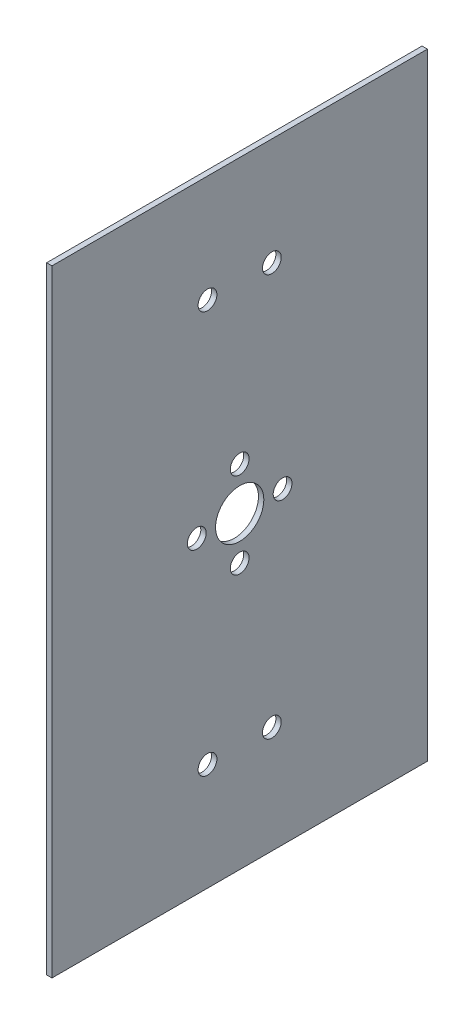
ISO-10303-21;
HEADER;
FILE_DESCRIPTION(('STEP AP214'),'2;1');
FILE_NAME('part.step','',(''),(''),'','','');
FILE_SCHEMA(('AUTOMOTIVE_DESIGN { 1 0 10303 214 1 1 1 1 }'));
ENDSEC;
DATA;
#1=APPLICATION_CONTEXT('core data for automotive mechanical design processes');
#2=APPLICATION_PROTOCOL_DEFINITION('international standard','automotive_design',2000,#1);
#3=PRODUCT_CONTEXT('',#1,'mechanical');
#4=PRODUCT('Part','Part','',(#3));
#5=PRODUCT_RELATED_PRODUCT_CATEGORY('part','',(#4));
#6=PRODUCT_DEFINITION_FORMATION('','',#4);
#7=PRODUCT_DEFINITION_CONTEXT('part definition',#1,'design');
#8=PRODUCT_DEFINITION('design','',#6,#7);
#9=PRODUCT_DEFINITION_SHAPE('','',#8);
#10=(LENGTH_UNIT() NAMED_UNIT(*) SI_UNIT(.MILLI.,.METRE.));
#11=(NAMED_UNIT(*) PLANE_ANGLE_UNIT() SI_UNIT($,.RADIAN.));
#12=(NAMED_UNIT(*) SI_UNIT($,.STERADIAN.) SOLID_ANGLE_UNIT());
#13=UNCERTAINTY_MEASURE_WITH_UNIT(LENGTH_MEASURE(1.E-05),#10,'distance_accuracy_value','');
#14=(GEOMETRIC_REPRESENTATION_CONTEXT(3) GLOBAL_UNCERTAINTY_ASSIGNED_CONTEXT((#13)) GLOBAL_UNIT_ASSIGNED_CONTEXT((#10,
#11,#12)) REPRESENTATION_CONTEXT('',''));
#15=CARTESIAN_POINT('',(0.,0.,0.));
#16=DIRECTION('',(0.,0.,1.));
#17=DIRECTION('',(1.,0.,0.));
#18=AXIS2_PLACEMENT_3D('',#15,#16,#17);
#19=CARTESIAN_POINT('',(1.,0.,0.));
#20=DIRECTION('',(1.,0.,0.));
#21=DIRECTION('',(0.,0.,-1.));
#22=AXIS2_PLACEMENT_3D('',#19,#20,#21);
#23=PLANE('',#22);
#24=CARTESIAN_POINT('',(1.,-37.5,-6.));
#25=DIRECTION('',(1.,0.,0.));
#26=DIRECTION('',(0.,0.,-1.));
#27=AXIS2_PLACEMENT_3D('',#24,#25,#26);
#28=CIRCLE('',#27,1.75);
#29=CARTESIAN_POINT('',(1.,-37.5,-7.75));
#30=VERTEX_POINT('',#29);
#31=EDGE_CURVE('E182',#30,#30,#28,.T.);
#32=ORIENTED_EDGE('',*,*,#31,.F.);
#33=EDGE_LOOP('',(#32));
#34=FACE_BOUND('',#33,.T.);
#35=CARTESIAN_POINT('',(1.,37.5,6.));
#36=DIRECTION('',(1.,0.,0.));
#37=DIRECTION('',(0.,0.,-1.));
#38=AXIS2_PLACEMENT_3D('',#35,#36,#37);
#39=CIRCLE('',#38,1.75);
#40=CARTESIAN_POINT('',(1.,37.5,4.25));
#41=VERTEX_POINT('',#40);
#42=EDGE_CURVE('E166',#41,#41,#39,.T.);
#43=ORIENTED_EDGE('',*,*,#42,.F.);
#44=EDGE_LOOP('',(#43));
#45=FACE_BOUND('',#44,.T.);
#46=CARTESIAN_POINT('',(1.,-8.,-5.39914649654326E-13));
#47=DIRECTION('',(1.,0.,0.));
#48=DIRECTION('',(0.,0.,-1.));
#49=AXIS2_PLACEMENT_3D('',#46,#47,#48);
#50=CIRCLE('',#49,1.75);
#51=CARTESIAN_POINT('',(1.,-8.,-1.75000000000054));
#52=VERTEX_POINT('',#51);
#53=EDGE_CURVE('E150',#52,#52,#50,.T.);
#54=ORIENTED_EDGE('',*,*,#53,.F.);
#55=EDGE_LOOP('',(#54));
#56=FACE_BOUND('',#55,.T.);
#57=CARTESIAN_POINT('',(1.,8.,0.));
#58=DIRECTION('',(1.,0.,0.));
#59=DIRECTION('',(0.,0.,-1.));
#60=AXIS2_PLACEMENT_3D('',#57,#58,#59);
#61=CIRCLE('',#60,1.75);
#62=CARTESIAN_POINT('',(1.,8.,-1.75));
#63=VERTEX_POINT('',#62);
#64=EDGE_CURVE('E134',#63,#63,#61,.T.);
#65=ORIENTED_EDGE('',*,*,#64,.F.);
#66=EDGE_LOOP('',(#65));
#67=FACE_BOUND('',#66,.T.);
#68=DIRECTION('',(0.,1.,0.));
#69=VECTOR('',#68,1.);
#70=CARTESIAN_POINT('',(1.,57.5,-35.));
#71=LINE('',#70,#69);
#72=CARTESIAN_POINT('',(1.,-57.5,-35.));
#73=VERTEX_POINT('',#72);
#74=CARTESIAN_POINT('',(1.,57.5,-35.));
#75=VERTEX_POINT('',#74);
#76=EDGE_CURVE('E92',#73,#75,#71,.T.);
#77=ORIENTED_EDGE('',*,*,#76,.T.);
#78=DIRECTION('',(0.,0.,1.));
#79=VECTOR('',#78,1.);
#80=CARTESIAN_POINT('',(1.,57.5,35.));
#81=LINE('',#80,#79);
#82=CARTESIAN_POINT('',(1.,57.5,35.));
#83=VERTEX_POINT('',#82);
#84=EDGE_CURVE('E87',#75,#83,#81,.T.);
#85=ORIENTED_EDGE('',*,*,#84,.T.);
#86=DIRECTION('',(0.,-1.,0.));
#87=VECTOR('',#86,1.);
#88=CARTESIAN_POINT('',(1.,57.5,35.));
#89=LINE('',#88,#87);
#90=CARTESIAN_POINT('',(1.,-57.5,35.));
#91=VERTEX_POINT('',#90);
#92=EDGE_CURVE('E90',#83,#91,#89,.T.);
#93=ORIENTED_EDGE('',*,*,#92,.T.);
#94=DIRECTION('',(0.,0.,-1.));
#95=VECTOR('',#94,1.);
#96=CARTESIAN_POINT('',(1.,-57.5,35.));
#97=LINE('',#96,#95);
#98=EDGE_CURVE('E57',#91,#73,#97,.T.);
#99=ORIENTED_EDGE('',*,*,#98,.T.);
#100=EDGE_LOOP('',(#77,#85,#93,#99));
#101=FACE_BOUND('',#100,.T.);
#102=CARTESIAN_POINT('',(1.,0.,0.));
#103=DIRECTION('',(1.,0.,0.));
#104=DIRECTION('',(0.,0.,-1.));
#105=AXIS2_PLACEMENT_3D('',#102,#103,#104);
#106=CIRCLE('',#105,4.5);
#107=CARTESIAN_POINT('',(1.,0.,-4.5));
#108=VERTEX_POINT('',#107);
#109=EDGE_CURVE('E112',#108,#108,#106,.T.);
#110=ORIENTED_EDGE('',*,*,#109,.F.);
#111=EDGE_LOOP('',(#110));
#112=FACE_BOUND('',#111,.T.);
#113=CARTESIAN_POINT('',(1.,2.69043291955691E-13,-8.00000000000027));
#114=DIRECTION('',(1.,0.,0.));
#115=DIRECTION('',(0.,0.,-1.));
#116=AXIS2_PLACEMENT_3D('',#113,#114,#115);
#117=CIRCLE('',#116,1.75);
#118=CARTESIAN_POINT('',(1.,2.69043291955691E-13,-9.75000000000027));
#119=VERTEX_POINT('',#118);
#120=EDGE_CURVE('E142',#119,#119,#117,.T.);
#121=ORIENTED_EDGE('',*,*,#120,.F.);
#122=EDGE_LOOP('',(#121));
#123=FACE_BOUND('',#122,.T.);
#124=CARTESIAN_POINT('',(1.,-2.70023009395009E-13,7.99999999999973));
#125=DIRECTION('',(1.,0.,0.));
#126=DIRECTION('',(0.,0.,-1.));
#127=AXIS2_PLACEMENT_3D('',#124,#125,#126);
#128=CIRCLE('',#127,1.75);
#129=CARTESIAN_POINT('',(1.,-2.70023009395009E-13,6.24999999999973));
#130=VERTEX_POINT('',#129);
#131=EDGE_CURVE('E158',#130,#130,#128,.T.);
#132=ORIENTED_EDGE('',*,*,#131,.F.);
#133=EDGE_LOOP('',(#132));
#134=FACE_BOUND('',#133,.T.);
#135=CARTESIAN_POINT('',(1.,37.5,-6.));
#136=DIRECTION('',(1.,0.,0.));
#137=DIRECTION('',(0.,0.,1.));
#138=AXIS2_PLACEMENT_3D('',#135,#136,#137);
#139=CIRCLE('',#138,1.75);
#140=CARTESIAN_POINT('',(1.,37.5,-4.25));
#141=VERTEX_POINT('',#140);
#142=EDGE_CURVE('E174',#141,#141,#139,.T.);
#143=ORIENTED_EDGE('',*,*,#142,.F.);
#144=EDGE_LOOP('',(#143));
#145=FACE_BOUND('',#144,.T.);
#146=CARTESIAN_POINT('',(1.,-37.5,6.));
#147=DIRECTION('',(1.,0.,0.));
#148=DIRECTION('',(0.,0.,1.));
#149=AXIS2_PLACEMENT_3D('',#146,#147,#148);
#150=CIRCLE('',#149,1.75);
#151=CARTESIAN_POINT('',(1.,-37.5,7.75));
#152=VERTEX_POINT('',#151);
#153=EDGE_CURVE('E190',#152,#152,#150,.T.);
#154=ORIENTED_EDGE('',*,*,#153,.F.);
#155=EDGE_LOOP('',(#154));
#156=FACE_BOUND('',#155,.T.);
#157=ADVANCED_FACE('F39',(#34,#45,#56,#67,#101,#112,#123,#134,#145,#156),#23,.T.);
#158=CARTESIAN_POINT('',(0.,0.,0.));
#159=DIRECTION('',(1.,0.,0.));
#160=DIRECTION('',(0.,0.,-1.));
#161=AXIS2_PLACEMENT_3D('',#158,#159,#160);
#162=PLANE('',#161);
#163=DIRECTION('',(0.,1.,0.));
#164=VECTOR('',#163,1.);
#165=CARTESIAN_POINT('',(0.,57.5,-35.));
#166=LINE('',#165,#164);
#167=CARTESIAN_POINT('',(0.,-57.5,-35.));
#168=VERTEX_POINT('',#167);
#169=CARTESIAN_POINT('',(0.,57.5,-35.));
#170=VERTEX_POINT('',#169);
#171=EDGE_CURVE('E108',#168,#170,#166,.T.);
#172=ORIENTED_EDGE('',*,*,#171,.F.);
#173=DIRECTION('',(0.,0.,-1.));
#174=VECTOR('',#173,1.);
#175=CARTESIAN_POINT('',(0.,-57.5,35.));
#176=LINE('',#175,#174);
#177=CARTESIAN_POINT('',(0.,-57.5,35.));
#178=VERTEX_POINT('',#177);
#179=EDGE_CURVE('E80',#178,#168,#176,.T.);
#180=ORIENTED_EDGE('',*,*,#179,.F.);
#181=DIRECTION('',(0.,-1.,0.));
#182=VECTOR('',#181,1.);
#183=CARTESIAN_POINT('',(0.,57.5,35.));
#184=LINE('',#183,#182);
#185=CARTESIAN_POINT('',(0.,57.5,35.));
#186=VERTEX_POINT('',#185);
#187=EDGE_CURVE('E74',#186,#178,#184,.T.);
#188=ORIENTED_EDGE('',*,*,#187,.F.);
#189=DIRECTION('',(0.,0.,1.));
#190=VECTOR('',#189,1.);
#191=CARTESIAN_POINT('',(0.,57.5,35.));
#192=LINE('',#191,#190);
#193=EDGE_CURVE('E97',#170,#186,#192,.T.);
#194=ORIENTED_EDGE('',*,*,#193,.F.);
#195=EDGE_LOOP('',(#172,#180,#188,#194));
#196=FACE_BOUND('',#195,.T.);
#197=CARTESIAN_POINT('',(0.,0.,0.));
#198=DIRECTION('',(1.,0.,0.));
#199=DIRECTION('',(0.,0.,-1.));
#200=AXIS2_PLACEMENT_3D('',#197,#198,#199);
#201=CIRCLE('',#200,4.5);
#202=CARTESIAN_POINT('',(0.,0.,-4.5));
#203=VERTEX_POINT('',#202);
#204=EDGE_CURVE('E130',#203,#203,#201,.T.);
#205=ORIENTED_EDGE('',*,*,#204,.T.);
#206=EDGE_LOOP('',(#205));
#207=FACE_BOUND('',#206,.T.);
#208=CARTESIAN_POINT('',(0.,8.,0.));
#209=DIRECTION('',(1.,0.,0.));
#210=DIRECTION('',(0.,0.,-1.));
#211=AXIS2_PLACEMENT_3D('',#208,#209,#210);
#212=CIRCLE('',#211,1.75);
#213=CARTESIAN_POINT('',(0.,8.,-1.75));
#214=VERTEX_POINT('',#213);
#215=EDGE_CURVE('E138',#214,#214,#212,.T.);
#216=ORIENTED_EDGE('',*,*,#215,.T.);
#217=EDGE_LOOP('',(#216));
#218=FACE_BOUND('',#217,.T.);
#219=CARTESIAN_POINT('',(0.,2.69043291955691E-13,-8.00000000000027));
#220=DIRECTION('',(1.,0.,0.));
#221=DIRECTION('',(0.,0.,-1.));
#222=AXIS2_PLACEMENT_3D('',#219,#220,#221);
#223=CIRCLE('',#222,1.75);
#224=CARTESIAN_POINT('',(0.,2.69043291955691E-13,-9.75000000000027));
#225=VERTEX_POINT('',#224);
#226=EDGE_CURVE('E146',#225,#225,#223,.T.);
#227=ORIENTED_EDGE('',*,*,#226,.T.);
#228=EDGE_LOOP('',(#227));
#229=FACE_BOUND('',#228,.T.);
#230=CARTESIAN_POINT('',(0.,-8.,-5.39914649654326E-13));
#231=DIRECTION('',(1.,0.,0.));
#232=DIRECTION('',(0.,0.,-1.));
#233=AXIS2_PLACEMENT_3D('',#230,#231,#232);
#234=CIRCLE('',#233,1.75);
#235=CARTESIAN_POINT('',(0.,-8.,-1.75000000000054));
#236=VERTEX_POINT('',#235);
#237=EDGE_CURVE('E154',#236,#236,#234,.T.);
#238=ORIENTED_EDGE('',*,*,#237,.T.);
#239=EDGE_LOOP('',(#238));
#240=FACE_BOUND('',#239,.T.);
#241=CARTESIAN_POINT('',(0.,-2.70023009395009E-13,7.99999999999973));
#242=DIRECTION('',(1.,0.,0.));
#243=DIRECTION('',(0.,0.,-1.));
#244=AXIS2_PLACEMENT_3D('',#241,#242,#243);
#245=CIRCLE('',#244,1.75);
#246=CARTESIAN_POINT('',(0.,-2.70023009395009E-13,6.24999999999973));
#247=VERTEX_POINT('',#246);
#248=EDGE_CURVE('E162',#247,#247,#245,.T.);
#249=ORIENTED_EDGE('',*,*,#248,.T.);
#250=EDGE_LOOP('',(#249));
#251=FACE_BOUND('',#250,.T.);
#252=CARTESIAN_POINT('',(0.,37.5,6.));
#253=DIRECTION('',(1.,0.,0.));
#254=DIRECTION('',(0.,0.,-1.));
#255=AXIS2_PLACEMENT_3D('',#252,#253,#254);
#256=CIRCLE('',#255,1.75);
#257=CARTESIAN_POINT('',(0.,37.5,4.25));
#258=VERTEX_POINT('',#257);
#259=EDGE_CURVE('E170',#258,#258,#256,.T.);
#260=ORIENTED_EDGE('',*,*,#259,.T.);
#261=EDGE_LOOP('',(#260));
#262=FACE_BOUND('',#261,.T.);
#263=CARTESIAN_POINT('',(0.,37.5,-6.));
#264=DIRECTION('',(1.,0.,0.));
#265=DIRECTION('',(0.,0.,1.));
#266=AXIS2_PLACEMENT_3D('',#263,#264,#265);
#267=CIRCLE('',#266,1.75);
#268=CARTESIAN_POINT('',(0.,37.5,-4.25));
#269=VERTEX_POINT('',#268);
#270=EDGE_CURVE('E178',#269,#269,#267,.T.);
#271=ORIENTED_EDGE('',*,*,#270,.T.);
#272=EDGE_LOOP('',(#271));
#273=FACE_BOUND('',#272,.T.);
#274=CARTESIAN_POINT('',(0.,-37.5,-6.));
#275=DIRECTION('',(1.,0.,0.));
#276=DIRECTION('',(0.,0.,-1.));
#277=AXIS2_PLACEMENT_3D('',#274,#275,#276);
#278=CIRCLE('',#277,1.75);
#279=CARTESIAN_POINT('',(0.,-37.5,-7.75));
#280=VERTEX_POINT('',#279);
#281=EDGE_CURVE('E186',#280,#280,#278,.T.);
#282=ORIENTED_EDGE('',*,*,#281,.T.);
#283=EDGE_LOOP('',(#282));
#284=FACE_BOUND('',#283,.T.);
#285=CARTESIAN_POINT('',(0.,-37.5,6.));
#286=DIRECTION('',(1.,0.,0.));
#287=DIRECTION('',(0.,0.,1.));
#288=AXIS2_PLACEMENT_3D('',#285,#286,#287);
#289=CIRCLE('',#288,1.75);
#290=CARTESIAN_POINT('',(0.,-37.5,7.75));
#291=VERTEX_POINT('',#290);
#292=EDGE_CURVE('E194',#291,#291,#289,.T.);
#293=ORIENTED_EDGE('',*,*,#292,.T.);
#294=EDGE_LOOP('',(#293));
#295=FACE_BOUND('',#294,.T.);
#296=ADVANCED_FACE('F125',(#196,#207,#218,#229,#240,#251,#262,#273,#284,#295),#162,.F.);
#297=CARTESIAN_POINT('',(1.,57.5,-35.));
#298=DIRECTION('',(0.,0.,1.));
#299=DIRECTION('',(1.,0.,0.));
#300=AXIS2_PLACEMENT_3D('',#297,#298,#299);
#301=PLANE('',#300);
#302=ORIENTED_EDGE('',*,*,#171,.T.);
#303=DIRECTION('',(-1.,0.,0.));
#304=VECTOR('',#303,1.);
#305=CARTESIAN_POINT('',(1.,57.5,-35.));
#306=LINE('',#305,#304);
#307=EDGE_CURVE('E11',#75,#170,#306,.T.);
#308=ORIENTED_EDGE('',*,*,#307,.F.);
#309=ORIENTED_EDGE('',*,*,#76,.F.);
#310=DIRECTION('',(-1.,0.,0.));
#311=VECTOR('',#310,1.);
#312=CARTESIAN_POINT('',(1.,-57.5,-35.));
#313=LINE('',#312,#311);
#314=EDGE_CURVE('E104',#73,#168,#313,.T.);
#315=ORIENTED_EDGE('',*,*,#314,.T.);
#316=EDGE_LOOP('',(#302,#308,#309,#315));
#317=FACE_BOUND('',#316,.T.);
#318=ADVANCED_FACE('F41',(#317),#301,.F.);
#319=CARTESIAN_POINT('',(1.,57.5,35.));
#320=DIRECTION('',(0.,-1.,0.));
#321=DIRECTION('',(0.,0.,-1.));
#322=AXIS2_PLACEMENT_3D('',#319,#320,#321);
#323=PLANE('',#322);
#324=ORIENTED_EDGE('',*,*,#193,.T.);
#325=DIRECTION('',(-1.,0.,0.));
#326=VECTOR('',#325,1.);
#327=CARTESIAN_POINT('',(1.,57.5,35.));
#328=LINE('',#327,#326);
#329=EDGE_CURVE('E49',#83,#186,#328,.T.);
#330=ORIENTED_EDGE('',*,*,#329,.F.);
#331=ORIENTED_EDGE('',*,*,#84,.F.);
#332=ORIENTED_EDGE('',*,*,#307,.T.);
#333=EDGE_LOOP('',(#324,#330,#331,#332));
#334=FACE_BOUND('',#333,.T.);
#335=ADVANCED_FACE('F96',(#334),#323,.F.);
#336=CARTESIAN_POINT('',(1.,57.5,35.));
#337=DIRECTION('',(0.,0.,-1.));
#338=DIRECTION('',(-1.,0.,0.));
#339=AXIS2_PLACEMENT_3D('',#336,#337,#338);
#340=PLANE('',#339);
#341=ORIENTED_EDGE('',*,*,#187,.T.);
#342=DIRECTION('',(-1.,0.,0.));
#343=VECTOR('',#342,1.);
#344=CARTESIAN_POINT('',(1.,-57.5,35.));
#345=LINE('',#344,#343);
#346=EDGE_CURVE('E99',#91,#178,#345,.T.);
#347=ORIENTED_EDGE('',*,*,#346,.F.);
#348=ORIENTED_EDGE('',*,*,#92,.F.);
#349=ORIENTED_EDGE('',*,*,#329,.T.);
#350=EDGE_LOOP('',(#341,#347,#348,#349));
#351=FACE_BOUND('',#350,.T.);
#352=ADVANCED_FACE('F100',(#351),#340,.F.);
#353=CARTESIAN_POINT('',(1.,-57.5,35.));
#354=DIRECTION('',(0.,1.,0.));
#355=DIRECTION('',(0.,0.,1.));
#356=AXIS2_PLACEMENT_3D('',#353,#354,#355);
#357=PLANE('',#356);
#358=ORIENTED_EDGE('',*,*,#179,.T.);
#359=ORIENTED_EDGE('',*,*,#314,.F.);
#360=ORIENTED_EDGE('',*,*,#98,.F.);
#361=ORIENTED_EDGE('',*,*,#346,.T.);
#362=EDGE_LOOP('',(#358,#359,#360,#361));
#363=FACE_BOUND('',#362,.T.);
#364=ADVANCED_FACE('F122',(#363),#357,.F.);
#365=CARTESIAN_POINT('',(1.,0.,0.));
#366=DIRECTION('',(-1.,0.,0.));
#367=DIRECTION('',(0.,0.,1.));
#368=AXIS2_PLACEMENT_3D('',#365,#366,#367);
#369=CYLINDRICAL_SURFACE('',#368,4.5);
#370=ORIENTED_EDGE('',*,*,#109,.T.);
#371=EDGE_LOOP('',(#370));
#372=FACE_BOUND('',#371,.T.);
#373=ORIENTED_EDGE('',*,*,#204,.F.);
#374=EDGE_LOOP('',(#373));
#375=FACE_BOUND('',#374,.T.);
#376=ADVANCED_FACE('F215',(#372,#375),#369,.F.);
#377=CARTESIAN_POINT('',(1.,8.,0.));
#378=DIRECTION('',(-1.,0.,0.));
#379=DIRECTION('',(0.,0.,1.));
#380=AXIS2_PLACEMENT_3D('',#377,#378,#379);
#381=CYLINDRICAL_SURFACE('',#380,1.75);
#382=ORIENTED_EDGE('',*,*,#64,.T.);
#383=EDGE_LOOP('',(#382));
#384=FACE_BOUND('',#383,.T.);
#385=ORIENTED_EDGE('',*,*,#215,.F.);
#386=EDGE_LOOP('',(#385));
#387=FACE_BOUND('',#386,.T.);
#388=ADVANCED_FACE('F261',(#384,#387),#381,.F.);
#389=CARTESIAN_POINT('',(1.,2.69043291955691E-13,-8.00000000000027));
#390=DIRECTION('',(-1.,0.,0.));
#391=DIRECTION('',(0.,0.,1.));
#392=AXIS2_PLACEMENT_3D('',#389,#390,#391);
#393=CYLINDRICAL_SURFACE('',#392,1.75);
#394=ORIENTED_EDGE('',*,*,#120,.T.);
#395=EDGE_LOOP('',(#394));
#396=FACE_BOUND('',#395,.T.);
#397=ORIENTED_EDGE('',*,*,#226,.F.);
#398=EDGE_LOOP('',(#397));
#399=FACE_BOUND('',#398,.T.);
#400=ADVANCED_FACE('F269',(#396,#399),#393,.F.);
#401=CARTESIAN_POINT('',(1.,-8.,-5.39914649654326E-13));
#402=DIRECTION('',(-1.,0.,0.));
#403=DIRECTION('',(0.,0.,1.));
#404=AXIS2_PLACEMENT_3D('',#401,#402,#403);
#405=CYLINDRICAL_SURFACE('',#404,1.75);
#406=ORIENTED_EDGE('',*,*,#53,.T.);
#407=EDGE_LOOP('',(#406));
#408=FACE_BOUND('',#407,.T.);
#409=ORIENTED_EDGE('',*,*,#237,.F.);
#410=EDGE_LOOP('',(#409));
#411=FACE_BOUND('',#410,.T.);
#412=ADVANCED_FACE('F277',(#408,#411),#405,.F.);
#413=CARTESIAN_POINT('',(1.,-2.70023009395009E-13,7.99999999999973));
#414=DIRECTION('',(-1.,0.,0.));
#415=DIRECTION('',(0.,0.,1.));
#416=AXIS2_PLACEMENT_3D('',#413,#414,#415);
#417=CYLINDRICAL_SURFACE('',#416,1.75);
#418=ORIENTED_EDGE('',*,*,#131,.T.);
#419=EDGE_LOOP('',(#418));
#420=FACE_BOUND('',#419,.T.);
#421=ORIENTED_EDGE('',*,*,#248,.F.);
#422=EDGE_LOOP('',(#421));
#423=FACE_BOUND('',#422,.T.);
#424=ADVANCED_FACE('F286',(#420,#423),#417,.F.);
#425=CARTESIAN_POINT('',(1.,37.5,6.));
#426=DIRECTION('',(-1.,0.,0.));
#427=DIRECTION('',(0.,0.,1.));
#428=AXIS2_PLACEMENT_3D('',#425,#426,#427);
#429=CYLINDRICAL_SURFACE('',#428,1.75);
#430=ORIENTED_EDGE('',*,*,#42,.T.);
#431=EDGE_LOOP('',(#430));
#432=FACE_BOUND('',#431,.T.);
#433=ORIENTED_EDGE('',*,*,#259,.F.);
#434=EDGE_LOOP('',(#433));
#435=FACE_BOUND('',#434,.T.);
#436=ADVANCED_FACE('F295',(#432,#435),#429,.F.);
#437=CARTESIAN_POINT('',(1.,37.5,-6.));
#438=DIRECTION('',(-1.,0.,0.));
#439=DIRECTION('',(0.,0.,1.));
#440=AXIS2_PLACEMENT_3D('',#437,#438,#439);
#441=CYLINDRICAL_SURFACE('',#440,1.75);
#442=ORIENTED_EDGE('',*,*,#142,.T.);
#443=EDGE_LOOP('',(#442));
#444=FACE_BOUND('',#443,.T.);
#445=ORIENTED_EDGE('',*,*,#270,.F.);
#446=EDGE_LOOP('',(#445));
#447=FACE_BOUND('',#446,.T.);
#448=ADVANCED_FACE('F304',(#444,#447),#441,.F.);
#449=CARTESIAN_POINT('',(1.,-37.5,-6.));
#450=DIRECTION('',(-1.,0.,0.));
#451=DIRECTION('',(0.,0.,1.));
#452=AXIS2_PLACEMENT_3D('',#449,#450,#451);
#453=CYLINDRICAL_SURFACE('',#452,1.75);
#454=ORIENTED_EDGE('',*,*,#31,.T.);
#455=EDGE_LOOP('',(#454));
#456=FACE_BOUND('',#455,.T.);
#457=ORIENTED_EDGE('',*,*,#281,.F.);
#458=EDGE_LOOP('',(#457));
#459=FACE_BOUND('',#458,.T.);
#460=ADVANCED_FACE('F313',(#456,#459),#453,.F.);
#461=CARTESIAN_POINT('',(1.,-37.5,6.));
#462=DIRECTION('',(-1.,0.,0.));
#463=DIRECTION('',(0.,0.,1.));
#464=AXIS2_PLACEMENT_3D('',#461,#462,#463);
#465=CYLINDRICAL_SURFACE('',#464,1.75);
#466=ORIENTED_EDGE('',*,*,#153,.T.);
#467=EDGE_LOOP('',(#466));
#468=FACE_BOUND('',#467,.T.);
#469=ORIENTED_EDGE('',*,*,#292,.F.);
#470=EDGE_LOOP('',(#469));
#471=FACE_BOUND('',#470,.T.);
#472=ADVANCED_FACE('F202',(#468,#471),#465,.F.);
#473=CLOSED_SHELL('',(#157,#296,#318,#335,#352,#364,#376,#388,#400,#412,#424,#436,#448,#460,#472));
#474=MANIFOLD_SOLID_BREP('B2',#473);
#475=ADVANCED_BREP_SHAPE_REPRESENTATION('',(#18,#474),#14);
#476=SHAPE_DEFINITION_REPRESENTATION(#9,#475);
ENDSEC;
END-ISO-10303-21;
